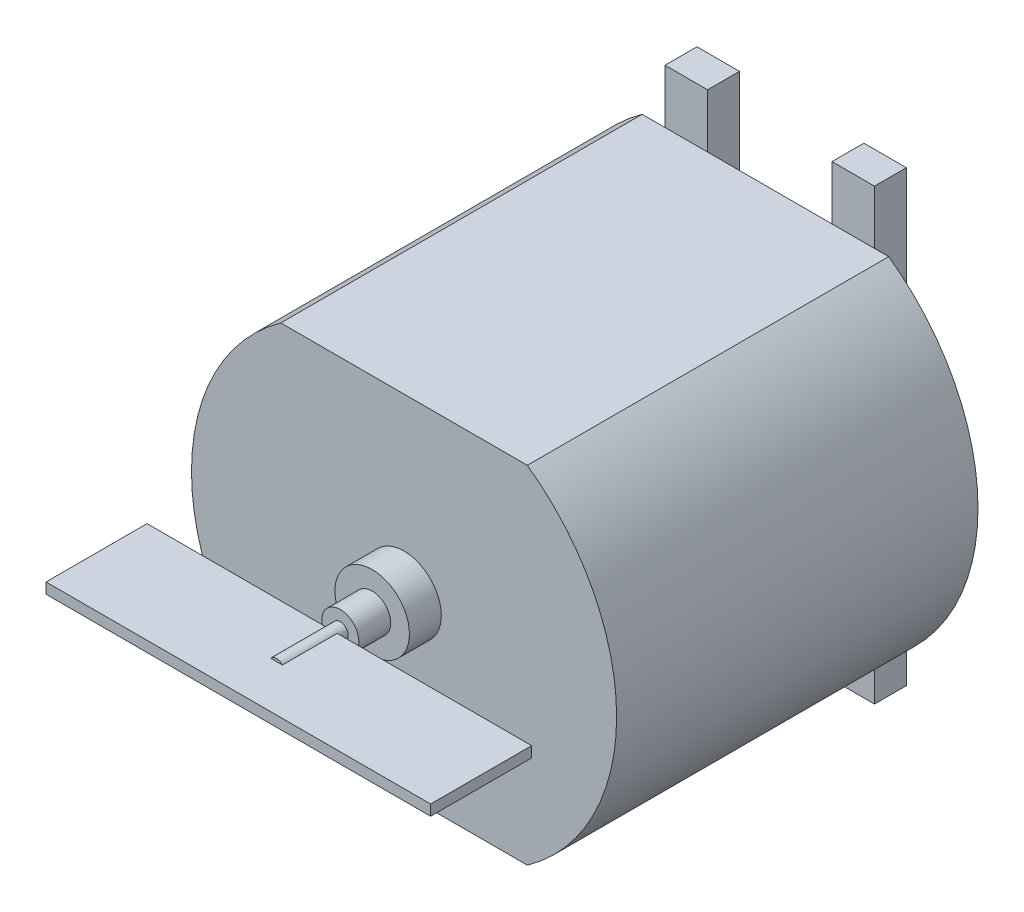
ISO-10303-21;
HEADER;
FILE_DESCRIPTION(('STEP AP214'),'2;1');
FILE_NAME('part.step','',(''),(''),'','','');
FILE_SCHEMA(('AUTOMOTIVE_DESIGN { 1 0 10303 214 1 1 1 1 }'));
ENDSEC;
DATA;
#1=APPLICATION_CONTEXT('core data for automotive mechanical design processes');
#2=APPLICATION_PROTOCOL_DEFINITION('international standard','automotive_design',2000,#1);
#3=PRODUCT_CONTEXT('',#1,'mechanical');
#4=PRODUCT('Part','Part','',(#3));
#5=PRODUCT_RELATED_PRODUCT_CATEGORY('part','',(#4));
#6=PRODUCT_DEFINITION_FORMATION('','',#4);
#7=PRODUCT_DEFINITION_CONTEXT('part definition',#1,'design');
#8=PRODUCT_DEFINITION('design','',#6,#7);
#9=PRODUCT_DEFINITION_SHAPE('','',#8);
#10=(LENGTH_UNIT() NAMED_UNIT(*) SI_UNIT(.MILLI.,.METRE.));
#11=(NAMED_UNIT(*) PLANE_ANGLE_UNIT() SI_UNIT($,.RADIAN.));
#12=(NAMED_UNIT(*) SI_UNIT($,.STERADIAN.) SOLID_ANGLE_UNIT());
#13=UNCERTAINTY_MEASURE_WITH_UNIT(LENGTH_MEASURE(1.E-05),#10,'distance_accuracy_value','');
#14=(GEOMETRIC_REPRESENTATION_CONTEXT(3) GLOBAL_UNCERTAINTY_ASSIGNED_CONTEXT((#13)) GLOBAL_UNIT_ASSIGNED_CONTEXT((#10,
#11,#12)) REPRESENTATION_CONTEXT('',''));
#15=CARTESIAN_POINT('',(0.,0.,0.));
#16=DIRECTION('',(0.,0.,1.));
#17=DIRECTION('',(1.,0.,0.));
#18=AXIS2_PLACEMENT_3D('',#15,#16,#17);
#19=CARTESIAN_POINT('',(0.,0.,46.));
#20=DIRECTION('',(0.,0.,1.));
#21=DIRECTION('',(1.,0.,0.));
#22=AXIS2_PLACEMENT_3D('',#19,#20,#21);
#23=PLANE('',#22);
#24=CARTESIAN_POINT('',(0.,0.,46.));
#25=DIRECTION('',(0.,0.,1.));
#26=DIRECTION('',(1.,0.,0.));
#27=AXIS2_PLACEMENT_3D('',#24,#25,#26);
#28=CIRCLE('',#27,0.749347306105546);
#29=CARTESIAN_POINT('',(0.558141008319259,0.5,46.));
#30=VERTEX_POINT('',#29);
#31=CARTESIAN_POINT('',(-0.558141008319259,0.5,46.));
#32=VERTEX_POINT('',#31);
#33=EDGE_CURVE('E319',#30,#32,#28,.T.);
#34=ORIENTED_EDGE('',*,*,#33,.T.);
#35=DIRECTION('',(1.,0.,0.));
#36=VECTOR('',#35,1.);
#37=CARTESIAN_POINT('',(0.,0.5,46.));
#38=LINE('',#37,#36);
#39=EDGE_CURVE('E374',#32,#30,#38,.T.);
#40=ORIENTED_EDGE('',*,*,#39,.T.);
#41=EDGE_LOOP('',(#34,#40));
#42=FACE_BOUND('',#41,.T.);
#43=ADVANCED_FACE('F32',(#42),#23,.T.);
#44=CARTESIAN_POINT('',(0.,0.,0.));
#45=DIRECTION('',(0.,0.,1.));
#46=DIRECTION('',(1.,0.,0.));
#47=AXIS2_PLACEMENT_3D('',#44,#45,#46);
#48=PLANE('',#47);
#49=DIRECTION('',(0.,-1.,0.));
#50=VECTOR('',#49,1.);
#51=CARTESIAN_POINT('',(-5.44286471798937,21.369936064893,0.));
#52=LINE('',#51,#50);
#53=CARTESIAN_POINT('',(-5.44286471798937,16.2926966628899,0.));
#54=VERTEX_POINT('',#53);
#55=CARTESIAN_POINT('',(-5.44286471798937,-16.2926966628899,0.));
#56=VERTEX_POINT('',#55);
#57=EDGE_CURVE('E264',#54,#56,#52,.T.);
#58=ORIENTED_EDGE('',*,*,#57,.F.);
#59=DIRECTION('',(-1.,0.,0.));
#60=VECTOR('',#59,1.);
#61=CARTESIAN_POINT('',(-11.5994842752191,16.2926966628899,0.));
#62=LINE('',#61,#60);
#63=CARTESIAN_POINT('',(6.26113840276687,16.2926966628899,0.));
#64=VERTEX_POINT('',#63);
#65=EDGE_CURVE('E497',#64,#54,#62,.T.);
#66=ORIENTED_EDGE('',*,*,#65,.F.);
#67=DIRECTION('',(0.,1.,0.));
#68=VECTOR('',#67,1.);
#69=CARTESIAN_POINT('',(6.26113840276687,21.369936064893,0.));
#70=LINE('',#69,#68);
#71=CARTESIAN_POINT('',(6.26113840276687,-16.2926966628899,0.));
#72=VERTEX_POINT('',#71);
#73=EDGE_CURVE('E305',#72,#64,#70,.T.);
#74=ORIENTED_EDGE('',*,*,#73,.F.);
#75=DIRECTION('',(1.,0.,0.));
#76=VECTOR('',#75,1.);
#77=CARTESIAN_POINT('',(-11.5994842752191,-16.2926966628899,0.));
#78=LINE('',#77,#76);
#79=EDGE_CURVE('E356',#56,#72,#78,.T.);
#80=ORIENTED_EDGE('',*,*,#79,.F.);
#81=EDGE_LOOP('',(#58,#66,#74,#80));
#82=FACE_BOUND('',#81,.T.);
#83=ADVANCED_FACE('F405',(#82),#48,.F.);
#84=DIRECTION('',(0.,1.,0.));
#85=VECTOR('',#84,1.);
#86=CARTESIAN_POINT('',(-9.44286471798937,21.369936064893,0.));
#87=LINE('',#86,#85);
#88=CARTESIAN_POINT('',(-9.44286471798937,-16.2926966628899,0.));
#89=VERTEX_POINT('',#88);
#90=CARTESIAN_POINT('',(-9.44286471798937,16.2926966628899,0.));
#91=VERTEX_POINT('',#90);
#92=EDGE_CURVE('E55',#89,#91,#87,.T.);
#93=ORIENTED_EDGE('',*,*,#92,.F.);
#94=CARTESIAN_POINT('',(-11.5994842752191,-16.2926966628899,0.));
#95=VERTEX_POINT('',#94);
#96=EDGE_CURVE('E352',#95,#89,#78,.T.);
#97=ORIENTED_EDGE('',*,*,#96,.F.);
#98=CARTESIAN_POINT('',(0.,0.,0.));
#99=DIRECTION('',(0.,0.,1.));
#100=DIRECTION('',(1.,0.,0.));
#101=AXIS2_PLACEMENT_3D('',#98,#99,#100);
#102=CIRCLE('',#101,20.);
#103=CARTESIAN_POINT('',(-11.5994842752191,16.2926966628899,0.));
#104=VERTEX_POINT('',#103);
#105=EDGE_CURVE('E335',#104,#95,#102,.T.);
#106=ORIENTED_EDGE('',*,*,#105,.F.);
#107=EDGE_CURVE('E359',#91,#104,#62,.T.);
#108=ORIENTED_EDGE('',*,*,#107,.F.);
#109=EDGE_LOOP('',(#93,#97,#106,#108));
#110=FACE_BOUND('',#109,.T.);
#111=ADVANCED_FACE('F412',(#110),#48,.F.);
#112=DIRECTION('',(0.,-1.,0.));
#113=VECTOR('',#112,1.);
#114=CARTESIAN_POINT('',(10.2611384027669,21.369936064893,0.));
#115=LINE('',#114,#113);
#116=CARTESIAN_POINT('',(10.2611384027669,16.2926966628899,0.));
#117=VERTEX_POINT('',#116);
#118=CARTESIAN_POINT('',(10.2611384027669,-16.2926966628899,0.));
#119=VERTEX_POINT('',#118);
#120=EDGE_CURVE('E299',#117,#119,#115,.T.);
#121=ORIENTED_EDGE('',*,*,#120,.F.);
#122=CARTESIAN_POINT('',(11.5994842752191,16.2926966628899,0.));
#123=VERTEX_POINT('',#122);
#124=EDGE_CURVE('E342',#123,#117,#62,.T.);
#125=ORIENTED_EDGE('',*,*,#124,.F.);
#126=CARTESIAN_POINT('',(0.,0.,0.));
#127=DIRECTION('',(0.,0.,1.));
#128=DIRECTION('',(1.,0.,0.));
#129=AXIS2_PLACEMENT_3D('',#126,#127,#128);
#130=CIRCLE('',#129,20.);
#131=CARTESIAN_POINT('',(11.5994842752191,-16.29269666289,0.));
#132=VERTEX_POINT('',#131);
#133=EDGE_CURVE('E355',#132,#123,#130,.T.);
#134=ORIENTED_EDGE('',*,*,#133,.F.);
#135=EDGE_CURVE('E351',#119,#132,#78,.T.);
#136=ORIENTED_EDGE('',*,*,#135,.F.);
#137=EDGE_LOOP('',(#121,#125,#134,#136));
#138=FACE_BOUND('',#137,.T.);
#139=ADVANCED_FACE('F415',(#138),#48,.F.);
#140=CARTESIAN_POINT('',(0.,0.,34.));
#141=DIRECTION('',(0.,0.,-1.));
#142=DIRECTION('',(-1.,0.,0.));
#143=AXIS2_PLACEMENT_3D('',#140,#141,#142);
#144=CYLINDRICAL_SURFACE('',#143,20.);
#145=ORIENTED_EDGE('',*,*,#105,.T.);
#146=DIRECTION('',(0.,0.,-1.));
#147=VECTOR('',#146,1.);
#148=CARTESIAN_POINT('',(-11.5994842752191,-16.2926966628899,34.));
#149=LINE('',#148,#147);
#150=CARTESIAN_POINT('',(-11.5994842752191,-16.2926966628899,34.));
#151=VERTEX_POINT('',#150);
#152=EDGE_CURVE('E371',#151,#95,#149,.T.);
#153=ORIENTED_EDGE('',*,*,#152,.F.);
#154=CARTESIAN_POINT('',(0.,0.,34.));
#155=DIRECTION('',(0.,0.,1.));
#156=DIRECTION('',(1.,0.,0.));
#157=AXIS2_PLACEMENT_3D('',#154,#155,#156);
#158=CIRCLE('',#157,20.);
#159=CARTESIAN_POINT('',(-11.5994842752191,16.2926966628899,34.));
#160=VERTEX_POINT('',#159);
#161=EDGE_CURVE('E338',#160,#151,#158,.T.);
#162=ORIENTED_EDGE('',*,*,#161,.F.);
#163=DIRECTION('',(0.,0.,-1.));
#164=VECTOR('',#163,1.);
#165=CARTESIAN_POINT('',(-11.5994842752191,16.2926966628899,34.));
#166=LINE('',#165,#164);
#167=EDGE_CURVE('E348',#160,#104,#166,.T.);
#168=ORIENTED_EDGE('',*,*,#167,.T.);
#169=EDGE_LOOP('',(#145,#153,#162,#168));
#170=FACE_BOUND('',#169,.T.);
#171=ADVANCED_FACE('F34',(#170),#144,.T.);
#172=CARTESIAN_POINT('',(-11.5994842752191,-16.2926966628899,34.));
#173=DIRECTION('',(0.,1.,0.));
#174=DIRECTION('',(0.,0.,1.));
#175=AXIS2_PLACEMENT_3D('',#172,#173,#174);
#176=PLANE('',#175);
#177=ORIENTED_EDGE('',*,*,#96,.T.);
#178=DIRECTION('',(-1.,0.,0.));
#179=VECTOR('',#178,1.);
#180=CARTESIAN_POINT('',(-11.5994842752191,-16.2926966628899,0.));
#181=LINE('',#180,#179);
#182=EDGE_CURVE('E281',#56,#89,#181,.T.);
#183=ORIENTED_EDGE('',*,*,#182,.F.);
#184=ORIENTED_EDGE('',*,*,#79,.T.);
#185=EDGE_CURVE('E357',#72,#119,#78,.T.);
#186=ORIENTED_EDGE('',*,*,#185,.T.);
#187=ORIENTED_EDGE('',*,*,#135,.T.);
#188=DIRECTION('',(0.,0.,-1.));
#189=VECTOR('',#188,1.);
#190=CARTESIAN_POINT('',(11.5994842752191,-16.29269666289,34.));
#191=LINE('',#190,#189);
#192=CARTESIAN_POINT('',(11.5994842752191,-16.29269666289,34.));
#193=VERTEX_POINT('',#192);
#194=EDGE_CURVE('E368',#193,#132,#191,.T.);
#195=ORIENTED_EDGE('',*,*,#194,.F.);
#196=DIRECTION('',(1.,0.,0.));
#197=VECTOR('',#196,1.);
#198=CARTESIAN_POINT('',(-11.5994842752191,-16.2926966628899,34.));
#199=LINE('',#198,#197);
#200=EDGE_CURVE('E341',#151,#193,#199,.T.);
#201=ORIENTED_EDGE('',*,*,#200,.F.);
#202=ORIENTED_EDGE('',*,*,#152,.T.);
#203=EDGE_LOOP('',(#177,#183,#184,#186,#187,#195,#201,#202));
#204=FACE_BOUND('',#203,.T.);
#205=ADVANCED_FACE('F511',(#204),#176,.F.);
#206=CARTESIAN_POINT('',(0.,0.,34.));
#207=DIRECTION('',(0.,0.,-1.));
#208=DIRECTION('',(-1.,0.,0.));
#209=AXIS2_PLACEMENT_3D('',#206,#207,#208);
#210=CYLINDRICAL_SURFACE('',#209,20.);
#211=ORIENTED_EDGE('',*,*,#133,.T.);
#212=DIRECTION('',(0.,0.,-1.));
#213=VECTOR('',#212,1.);
#214=CARTESIAN_POINT('',(11.5994842752191,16.2926966628899,34.));
#215=LINE('',#214,#213);
#216=CARTESIAN_POINT('',(11.5994842752191,16.2926966628899,34.));
#217=VERTEX_POINT('',#216);
#218=EDGE_CURVE('E365',#217,#123,#215,.T.);
#219=ORIENTED_EDGE('',*,*,#218,.F.);
#220=CARTESIAN_POINT('',(0.,0.,34.));
#221=DIRECTION('',(0.,0.,1.));
#222=DIRECTION('',(1.,0.,0.));
#223=AXIS2_PLACEMENT_3D('',#220,#221,#222);
#224=CIRCLE('',#223,20.);
#225=EDGE_CURVE('E344',#193,#217,#224,.T.);
#226=ORIENTED_EDGE('',*,*,#225,.F.);
#227=ORIENTED_EDGE('',*,*,#194,.T.);
#228=EDGE_LOOP('',(#211,#219,#226,#227));
#229=FACE_BOUND('',#228,.T.);
#230=ADVANCED_FACE('F534',(#229),#210,.T.);
#231=CARTESIAN_POINT('',(-11.5994842752191,16.2926966628899,34.));
#232=DIRECTION('',(0.,-1.,0.));
#233=DIRECTION('',(0.,0.,-1.));
#234=AXIS2_PLACEMENT_3D('',#231,#232,#233);
#235=PLANE('',#234);
#236=ORIENTED_EDGE('',*,*,#124,.T.);
#237=EDGE_CURVE('E362',#117,#64,#62,.T.);
#238=ORIENTED_EDGE('',*,*,#237,.T.);
#239=ORIENTED_EDGE('',*,*,#65,.T.);
#240=EDGE_CURVE('E498',#54,#91,#62,.T.);
#241=ORIENTED_EDGE('',*,*,#240,.T.);
#242=ORIENTED_EDGE('',*,*,#107,.T.);
#243=ORIENTED_EDGE('',*,*,#167,.F.);
#244=DIRECTION('',(-1.,0.,0.));
#245=VECTOR('',#244,1.);
#246=CARTESIAN_POINT('',(-11.5994842752191,16.2926966628899,34.));
#247=LINE('',#246,#245);
#248=EDGE_CURVE('E346',#217,#160,#247,.T.);
#249=ORIENTED_EDGE('',*,*,#248,.F.);
#250=ORIENTED_EDGE('',*,*,#218,.T.);
#251=EDGE_LOOP('',(#236,#238,#239,#241,#242,#243,#249,#250));
#252=FACE_BOUND('',#251,.T.);
#253=ADVANCED_FACE('F502',(#252),#235,.F.);
#254=CARTESIAN_POINT('',(0.,0.,34.));
#255=DIRECTION('',(0.,0.,1.));
#256=DIRECTION('',(1.,0.,0.));
#257=AXIS2_PLACEMENT_3D('',#254,#255,#256);
#258=PLANE('',#257);
#259=CARTESIAN_POINT('',(0.,0.,34.));
#260=DIRECTION('',(0.,0.,1.));
#261=DIRECTION('',(1.,0.,0.));
#262=AXIS2_PLACEMENT_3D('',#259,#260,#261);
#263=CIRCLE('',#262,3.50367255302534);
#264=CARTESIAN_POINT('',(3.50367255302534,0.,34.));
#265=VERTEX_POINT('',#264);
#266=EDGE_CURVE('E329',#265,#265,#263,.T.);
#267=ORIENTED_EDGE('',*,*,#266,.F.);
#268=EDGE_LOOP('',(#267));
#269=FACE_BOUND('',#268,.T.);
#270=ORIENTED_EDGE('',*,*,#161,.T.);
#271=ORIENTED_EDGE('',*,*,#200,.T.);
#272=ORIENTED_EDGE('',*,*,#225,.T.);
#273=ORIENTED_EDGE('',*,*,#248,.T.);
#274=EDGE_LOOP('',(#270,#271,#272,#273));
#275=FACE_BOUND('',#274,.T.);
#276=ADVANCED_FACE('F515',(#269,#275),#258,.T.);
#277=CARTESIAN_POINT('',(0.,0.,37.));
#278=DIRECTION('',(0.,0.,-1.));
#279=DIRECTION('',(-1.,0.,0.));
#280=AXIS2_PLACEMENT_3D('',#277,#278,#279);
#281=CYLINDRICAL_SURFACE('',#280,3.50367255302534);
#282=CARTESIAN_POINT('',(0.,0.,37.));
#283=DIRECTION('',(0.,0.,1.));
#284=DIRECTION('',(1.,0.,0.));
#285=AXIS2_PLACEMENT_3D('',#282,#283,#284);
#286=CIRCLE('',#285,3.50367255302534);
#287=CARTESIAN_POINT('',(3.50367255302534,0.,37.));
#288=VERTEX_POINT('',#287);
#289=EDGE_CURVE('E332',#288,#288,#286,.T.);
#290=ORIENTED_EDGE('',*,*,#289,.F.);
#291=EDGE_LOOP('',(#290));
#292=FACE_BOUND('',#291,.T.);
#293=ORIENTED_EDGE('',*,*,#266,.T.);
#294=EDGE_LOOP('',(#293));
#295=FACE_BOUND('',#294,.T.);
#296=ADVANCED_FACE('F546',(#292,#295),#281,.T.);
#297=CARTESIAN_POINT('',(0.,0.,37.));
#298=DIRECTION('',(0.,0.,1.));
#299=DIRECTION('',(1.,0.,0.));
#300=AXIS2_PLACEMENT_3D('',#297,#298,#299);
#301=PLANE('',#300);
#302=CARTESIAN_POINT('',(0.,0.,37.));
#303=DIRECTION('',(0.,0.,1.));
#304=DIRECTION('',(1.,0.,0.));
#305=AXIS2_PLACEMENT_3D('',#302,#303,#304);
#306=CIRCLE('',#305,1.74627977740914);
#307=CARTESIAN_POINT('',(1.74627977740914,0.,37.));
#308=VERTEX_POINT('',#307);
#309=EDGE_CURVE('E322',#308,#308,#306,.T.);
#310=ORIENTED_EDGE('',*,*,#309,.F.);
#311=EDGE_LOOP('',(#310));
#312=FACE_BOUND('',#311,.T.);
#313=ORIENTED_EDGE('',*,*,#289,.T.);
#314=EDGE_LOOP('',(#313));
#315=FACE_BOUND('',#314,.T.);
#316=ADVANCED_FACE('F550',(#312,#315),#301,.T.);
#317=CARTESIAN_POINT('',(0.,0.,40.));
#318=DIRECTION('',(0.,0.,-1.));
#319=DIRECTION('',(-1.,0.,0.));
#320=AXIS2_PLACEMENT_3D('',#317,#318,#319);
#321=CYLINDRICAL_SURFACE('',#320,1.74627977740914);
#322=CARTESIAN_POINT('',(0.,0.,40.));
#323=DIRECTION('',(0.,0.,1.));
#324=DIRECTION('',(1.,0.,0.));
#325=AXIS2_PLACEMENT_3D('',#322,#323,#324);
#326=CIRCLE('',#325,1.74627977740914);
#327=CARTESIAN_POINT('',(1.74627977740914,0.,40.));
#328=VERTEX_POINT('',#327);
#329=EDGE_CURVE('E326',#328,#328,#326,.T.);
#330=ORIENTED_EDGE('',*,*,#329,.F.);
#331=EDGE_LOOP('',(#330));
#332=FACE_BOUND('',#331,.T.);
#333=ORIENTED_EDGE('',*,*,#309,.T.);
#334=EDGE_LOOP('',(#333));
#335=FACE_BOUND('',#334,.T.);
#336=ADVANCED_FACE('F554',(#332,#335),#321,.T.);
#337=CARTESIAN_POINT('',(0.,0.,40.));
#338=DIRECTION('',(0.,0.,1.));
#339=DIRECTION('',(1.,0.,0.));
#340=AXIS2_PLACEMENT_3D('',#337,#338,#339);
#341=PLANE('',#340);
#342=CARTESIAN_POINT('',(0.,0.,40.));
#343=DIRECTION('',(0.,0.,1.));
#344=DIRECTION('',(1.,0.,0.));
#345=AXIS2_PLACEMENT_3D('',#342,#343,#344);
#346=CIRCLE('',#345,0.749347306105546);
#347=CARTESIAN_POINT('',(0.749347306105546,0.,40.));
#348=VERTEX_POINT('',#347);
#349=EDGE_CURVE('E318',#348,#348,#346,.T.);
#350=ORIENTED_EDGE('',*,*,#349,.F.);
#351=EDGE_LOOP('',(#350));
#352=FACE_BOUND('',#351,.T.);
#353=ORIENTED_EDGE('',*,*,#329,.T.);
#354=EDGE_LOOP('',(#353));
#355=FACE_BOUND('',#354,.T.);
#356=ADVANCED_FACE('F429',(#352,#355),#341,.T.);
#357=CARTESIAN_POINT('',(0.,0.,46.));
#358=DIRECTION('',(0.,0.,-1.));
#359=DIRECTION('',(-1.,0.,0.));
#360=AXIS2_PLACEMENT_3D('',#357,#358,#359);
#361=CYLINDRICAL_SURFACE('',#360,0.749347306105546);
#362=CARTESIAN_POINT('',(-0.558141008319259,-0.5,46.));
#363=VERTEX_POINT('',#362);
#364=CARTESIAN_POINT('',(0.558141008319259,-0.5,46.));
#365=VERTEX_POINT('',#364);
#366=EDGE_CURVE('E323',#363,#365,#28,.T.);
#367=ORIENTED_EDGE('',*,*,#366,.F.);
#368=DIRECTION('',(0.,0.,-1.));
#369=VECTOR('',#368,1.);
#370=CARTESIAN_POINT('',(-0.558141008319259,-0.5,46.));
#371=LINE('',#370,#369);
#372=CARTESIAN_POINT('',(-0.55814100831926,-0.5,40.8503491859536));
#373=VERTEX_POINT('',#372);
#374=EDGE_CURVE('E245',#363,#373,#371,.T.);
#375=ORIENTED_EDGE('',*,*,#374,.T.);
#376=CARTESIAN_POINT('',(0.,0.,40.8503491859536));
#377=DIRECTION('',(0.,0.,-1.));
#378=DIRECTION('',(-1.,0.,0.));
#379=AXIS2_PLACEMENT_3D('',#376,#377,#378);
#380=CIRCLE('',#379,0.749347306105546);
#381=CARTESIAN_POINT('',(-0.55814100831926,0.5,40.8503491859536));
#382=VERTEX_POINT('',#381);
#383=EDGE_CURVE('E11',#373,#382,#380,.T.);
#384=ORIENTED_EDGE('',*,*,#383,.T.);
#385=DIRECTION('',(0.,0.,-1.));
#386=VECTOR('',#385,1.);
#387=CARTESIAN_POINT('',(-0.558141008319259,0.5,46.));
#388=LINE('',#387,#386);
#389=EDGE_CURVE('E240',#32,#382,#388,.T.);
#390=ORIENTED_EDGE('',*,*,#389,.F.);
#391=ORIENTED_EDGE('',*,*,#33,.F.);
#392=DIRECTION('',(0.,0.,-1.));
#393=VECTOR('',#392,1.);
#394=CARTESIAN_POINT('',(0.558141008319259,0.5,46.));
#395=LINE('',#394,#393);
#396=CARTESIAN_POINT('',(0.55814100831926,0.5,40.8503491859536));
#397=VERTEX_POINT('',#396);
#398=EDGE_CURVE('E47',#397,#30,#395,.F.);
#399=ORIENTED_EDGE('',*,*,#398,.F.);
#400=CARTESIAN_POINT('',(0.55814100831926,-0.5,40.8503491859536));
#401=VERTEX_POINT('',#400);
#402=EDGE_CURVE('E36',#397,#401,#380,.T.);
#403=ORIENTED_EDGE('',*,*,#402,.T.);
#404=DIRECTION('',(0.,0.,-1.));
#405=VECTOR('',#404,1.);
#406=CARTESIAN_POINT('',(0.558141008319259,-0.5,46.));
#407=LINE('',#406,#405);
#408=EDGE_CURVE('E242',#401,#365,#407,.F.);
#409=ORIENTED_EDGE('',*,*,#408,.T.);
#410=EDGE_LOOP('',(#367,#375,#384,#390,#391,#399,#403,#409));
#411=FACE_BOUND('',#410,.T.);
#412=ORIENTED_EDGE('',*,*,#349,.T.);
#413=EDGE_LOOP('',(#412));
#414=FACE_BOUND('',#413,.T.);
#415=ADVANCED_FACE('F381',(#411,#414),#361,.T.);
#416=DIRECTION('',(1.,0.,0.));
#417=VECTOR('',#416,1.);
#418=CARTESIAN_POINT('',(0.,-0.5,46.));
#419=LINE('',#418,#417);
#420=EDGE_CURVE('E375',#363,#365,#419,.T.);
#421=ORIENTED_EDGE('',*,*,#420,.F.);
#422=ORIENTED_EDGE('',*,*,#366,.T.);
#423=EDGE_LOOP('',(#421,#422));
#424=FACE_BOUND('',#423,.T.);
#425=ADVANCED_FACE('F408',(#424),#23,.T.);
#426=CARTESIAN_POINT('',(0.,0.,0.));
#427=DIRECTION('',(0.,0.,-1.));
#428=DIRECTION('',(-1.,0.,0.));
#429=AXIS2_PLACEMENT_3D('',#426,#427,#428);
#430=PLANE('',#429);
#431=ORIENTED_EDGE('',*,*,#237,.F.);
#432=CARTESIAN_POINT('',(10.2611384027669,21.369936064893,0.));
#433=VERTEX_POINT('',#432);
#434=EDGE_CURVE('E295',#433,#117,#115,.T.);
#435=ORIENTED_EDGE('',*,*,#434,.F.);
#436=DIRECTION('',(1.,0.,0.));
#437=VECTOR('',#436,1.);
#438=CARTESIAN_POINT('',(10.2611384027669,21.369936064893,0.));
#439=LINE('',#438,#437);
#440=CARTESIAN_POINT('',(6.26113840276687,21.369936064893,0.));
#441=VERTEX_POINT('',#440);
#442=EDGE_CURVE('E288',#441,#433,#439,.T.);
#443=ORIENTED_EDGE('',*,*,#442,.F.);
#444=EDGE_CURVE('E301',#64,#441,#70,.T.);
#445=ORIENTED_EDGE('',*,*,#444,.F.);
#446=EDGE_LOOP('',(#431,#435,#443,#445));
#447=FACE_BOUND('',#446,.T.);
#448=ADVANCED_FACE('F419',(#447),#430,.F.);
#449=CARTESIAN_POINT('',(10.2611384027669,21.369936064893,-3.));
#450=DIRECTION('',(-1.,0.,0.));
#451=DIRECTION('',(0.,0.,1.));
#452=AXIS2_PLACEMENT_3D('',#449,#450,#451);
#453=PLANE('',#452);
#454=ORIENTED_EDGE('',*,*,#434,.T.);
#455=ORIENTED_EDGE('',*,*,#120,.T.);
#456=CARTESIAN_POINT('',(10.2611384027669,-20.8345723221394,0.));
#457=VERTEX_POINT('',#456);
#458=EDGE_CURVE('E283',#119,#457,#115,.T.);
#459=ORIENTED_EDGE('',*,*,#458,.T.);
#460=DIRECTION('',(0.,0.,1.));
#461=VECTOR('',#460,1.);
#462=CARTESIAN_POINT('',(10.2611384027669,-20.8345723221394,-3.));
#463=LINE('',#462,#461);
#464=CARTESIAN_POINT('',(10.2611384027669,-20.8345723221394,-3.));
#465=VERTEX_POINT('',#464);
#466=EDGE_CURVE('E315',#465,#457,#463,.T.);
#467=ORIENTED_EDGE('',*,*,#466,.F.);
#468=DIRECTION('',(0.,-1.,0.));
#469=VECTOR('',#468,1.);
#470=CARTESIAN_POINT('',(10.2611384027669,21.369936064893,-3.));
#471=LINE('',#470,#469);
#472=CARTESIAN_POINT('',(10.2611384027669,21.369936064893,-3.));
#473=VERTEX_POINT('',#472);
#474=EDGE_CURVE('E284',#473,#465,#471,.T.);
#475=ORIENTED_EDGE('',*,*,#474,.F.);
#476=DIRECTION('',(0.,0.,1.));
#477=VECTOR('',#476,1.);
#478=CARTESIAN_POINT('',(10.2611384027669,21.369936064893,-3.));
#479=LINE('',#478,#477);
#480=EDGE_CURVE('E294',#473,#433,#479,.T.);
#481=ORIENTED_EDGE('',*,*,#480,.T.);
#482=EDGE_LOOP('',(#454,#455,#459,#467,#475,#481));
#483=FACE_BOUND('',#482,.T.);
#484=ADVANCED_FACE('F425',(#483),#453,.F.);
#485=CARTESIAN_POINT('',(10.2611384027669,-20.8345723221394,-3.));
#486=DIRECTION('',(0.,1.,0.));
#487=DIRECTION('',(0.,0.,1.));
#488=AXIS2_PLACEMENT_3D('',#485,#486,#487);
#489=PLANE('',#488);
#490=DIRECTION('',(-1.,0.,0.));
#491=VECTOR('',#490,1.);
#492=CARTESIAN_POINT('',(10.2611384027669,-20.8345723221394,0.));
#493=LINE('',#492,#491);
#494=CARTESIAN_POINT('',(6.26113840276686,-20.8345723221394,0.));
#495=VERTEX_POINT('',#494);
#496=EDGE_CURVE('E298',#457,#495,#493,.T.);
#497=ORIENTED_EDGE('',*,*,#496,.T.);
#498=DIRECTION('',(0.,0.,1.));
#499=VECTOR('',#498,1.);
#500=CARTESIAN_POINT('',(6.26113840276686,-20.8345723221394,-3.));
#501=LINE('',#500,#499);
#502=CARTESIAN_POINT('',(6.26113840276686,-20.8345723221394,-3.));
#503=VERTEX_POINT('',#502);
#504=EDGE_CURVE('E312',#503,#495,#501,.T.);
#505=ORIENTED_EDGE('',*,*,#504,.F.);
#506=DIRECTION('',(-1.,0.,0.));
#507=VECTOR('',#506,1.);
#508=CARTESIAN_POINT('',(10.2611384027669,-20.8345723221394,-3.));
#509=LINE('',#508,#507);
#510=EDGE_CURVE('E287',#465,#503,#509,.T.);
#511=ORIENTED_EDGE('',*,*,#510,.F.);
#512=ORIENTED_EDGE('',*,*,#466,.T.);
#513=EDGE_LOOP('',(#497,#505,#511,#512));
#514=FACE_BOUND('',#513,.T.);
#515=ADVANCED_FACE('F478',(#514),#489,.F.);
#516=CARTESIAN_POINT('',(6.26113840276687,21.369936064893,-3.));
#517=DIRECTION('',(1.,0.,0.));
#518=DIRECTION('',(0.,1.,0.));
#519=AXIS2_PLACEMENT_3D('',#516,#517,#518);
#520=PLANE('',#519);
#521=EDGE_CURVE('E302',#495,#72,#70,.T.);
#522=ORIENTED_EDGE('',*,*,#521,.T.);
#523=ORIENTED_EDGE('',*,*,#73,.T.);
#524=ORIENTED_EDGE('',*,*,#444,.T.);
#525=DIRECTION('',(0.,0.,1.));
#526=VECTOR('',#525,1.);
#527=CARTESIAN_POINT('',(6.26113840276687,21.369936064893,-3.));
#528=LINE('',#527,#526);
#529=CARTESIAN_POINT('',(6.26113840276687,21.369936064893,-3.));
#530=VERTEX_POINT('',#529);
#531=EDGE_CURVE('E309',#530,#441,#528,.T.);
#532=ORIENTED_EDGE('',*,*,#531,.F.);
#533=DIRECTION('',(0.,1.,0.));
#534=VECTOR('',#533,1.);
#535=CARTESIAN_POINT('',(6.26113840276687,21.369936064893,-3.));
#536=LINE('',#535,#534);
#537=EDGE_CURVE('E290',#503,#530,#536,.T.);
#538=ORIENTED_EDGE('',*,*,#537,.F.);
#539=ORIENTED_EDGE('',*,*,#504,.T.);
#540=EDGE_LOOP('',(#522,#523,#524,#532,#538,#539));
#541=FACE_BOUND('',#540,.T.);
#542=ADVANCED_FACE('F474',(#541),#520,.F.);
#543=CARTESIAN_POINT('',(10.2611384027669,21.369936064893,-3.));
#544=DIRECTION('',(0.,-1.,0.));
#545=DIRECTION('',(0.,0.,-1.));
#546=AXIS2_PLACEMENT_3D('',#543,#544,#545);
#547=PLANE('',#546);
#548=ORIENTED_EDGE('',*,*,#442,.T.);
#549=ORIENTED_EDGE('',*,*,#480,.F.);
#550=DIRECTION('',(1.,0.,0.));
#551=VECTOR('',#550,1.);
#552=CARTESIAN_POINT('',(10.2611384027669,21.369936064893,-3.));
#553=LINE('',#552,#551);
#554=EDGE_CURVE('E292',#530,#473,#553,.T.);
#555=ORIENTED_EDGE('',*,*,#554,.F.);
#556=ORIENTED_EDGE('',*,*,#531,.T.);
#557=EDGE_LOOP('',(#548,#549,#555,#556));
#558=FACE_BOUND('',#557,.T.);
#559=ADVANCED_FACE('F467',(#558),#547,.F.);
#560=CARTESIAN_POINT('',(0.,0.,-3.));
#561=DIRECTION('',(0.,0.,-1.));
#562=DIRECTION('',(-1.,0.,0.));
#563=AXIS2_PLACEMENT_3D('',#560,#561,#562);
#564=PLANE('',#563);
#565=ORIENTED_EDGE('',*,*,#474,.T.);
#566=ORIENTED_EDGE('',*,*,#510,.T.);
#567=ORIENTED_EDGE('',*,*,#537,.T.);
#568=ORIENTED_EDGE('',*,*,#554,.T.);
#569=EDGE_LOOP('',(#565,#566,#567,#568));
#570=FACE_BOUND('',#569,.T.);
#571=ADVANCED_FACE('F465',(#570),#564,.T.);
#572=ORIENTED_EDGE('',*,*,#185,.F.);
#573=ORIENTED_EDGE('',*,*,#521,.F.);
#574=ORIENTED_EDGE('',*,*,#496,.F.);
#575=ORIENTED_EDGE('',*,*,#458,.F.);
#576=EDGE_LOOP('',(#572,#573,#574,#575));
#577=FACE_BOUND('',#576,.T.);
#578=ADVANCED_FACE('F428',(#577),#430,.F.);
#579=CARTESIAN_POINT('',(0.,0.,0.));
#580=DIRECTION('',(0.,0.,-1.));
#581=DIRECTION('',(-1.,0.,0.));
#582=AXIS2_PLACEMENT_3D('',#579,#580,#581);
#583=PLANE('',#582);
#584=CARTESIAN_POINT('',(-5.44286471798937,-20.8345723221394,0.));
#585=VERTEX_POINT('',#584);
#586=EDGE_CURVE('E248',#56,#585,#52,.T.);
#587=ORIENTED_EDGE('',*,*,#586,.F.);
#588=ORIENTED_EDGE('',*,*,#182,.T.);
#589=CARTESIAN_POINT('',(-9.44286471798937,-20.8345723221394,0.));
#590=VERTEX_POINT('',#589);
#591=EDGE_CURVE('E267',#590,#89,#87,.T.);
#592=ORIENTED_EDGE('',*,*,#591,.F.);
#593=DIRECTION('',(-1.,0.,0.));
#594=VECTOR('',#593,1.);
#595=CARTESIAN_POINT('',(-5.44286471798937,-20.8345723221394,0.));
#596=LINE('',#595,#594);
#597=EDGE_CURVE('E263',#585,#590,#596,.T.);
#598=ORIENTED_EDGE('',*,*,#597,.F.);
#599=EDGE_LOOP('',(#587,#588,#592,#598));
#600=FACE_BOUND('',#599,.T.);
#601=ADVANCED_FACE('F446',(#600),#583,.F.);
#602=CARTESIAN_POINT('',(-9.44286471798937,21.369936064893,0.));
#603=VERTEX_POINT('',#602);
#604=EDGE_CURVE('E266',#91,#603,#87,.T.);
#605=ORIENTED_EDGE('',*,*,#604,.F.);
#606=ORIENTED_EDGE('',*,*,#240,.F.);
#607=CARTESIAN_POINT('',(-5.44286471798937,21.369936064893,0.));
#608=VERTEX_POINT('',#607);
#609=EDGE_CURVE('E260',#608,#54,#52,.T.);
#610=ORIENTED_EDGE('',*,*,#609,.F.);
#611=DIRECTION('',(1.,0.,0.));
#612=VECTOR('',#611,1.);
#613=CARTESIAN_POINT('',(-5.44286471798937,21.369936064893,0.));
#614=LINE('',#613,#612);
#615=EDGE_CURVE('E253',#603,#608,#614,.T.);
#616=ORIENTED_EDGE('',*,*,#615,.F.);
#617=EDGE_LOOP('',(#605,#606,#610,#616));
#618=FACE_BOUND('',#617,.T.);
#619=ADVANCED_FACE('F449',(#618),#583,.F.);
#620=CARTESIAN_POINT('',(-5.44286471798937,21.369936064893,-3.));
#621=DIRECTION('',(-1.,0.,0.));
#622=DIRECTION('',(0.,-1.,0.));
#623=AXIS2_PLACEMENT_3D('',#620,#621,#622);
#624=PLANE('',#623);
#625=ORIENTED_EDGE('',*,*,#609,.T.);
#626=ORIENTED_EDGE('',*,*,#57,.T.);
#627=ORIENTED_EDGE('',*,*,#586,.T.);
#628=DIRECTION('',(0.,0.,1.));
#629=VECTOR('',#628,1.);
#630=CARTESIAN_POINT('',(-5.44286471798937,-20.8345723221394,-3.));
#631=LINE('',#630,#629);
#632=CARTESIAN_POINT('',(-5.44286471798937,-20.8345723221394,-3.));
#633=VERTEX_POINT('',#632);
#634=EDGE_CURVE('E278',#633,#585,#631,.T.);
#635=ORIENTED_EDGE('',*,*,#634,.F.);
#636=DIRECTION('',(0.,-1.,0.));
#637=VECTOR('',#636,1.);
#638=CARTESIAN_POINT('',(-5.44286471798937,21.369936064893,-3.));
#639=LINE('',#638,#637);
#640=CARTESIAN_POINT('',(-5.44286471798937,21.369936064893,-3.));
#641=VERTEX_POINT('',#640);
#642=EDGE_CURVE('E249',#641,#633,#639,.T.);
#643=ORIENTED_EDGE('',*,*,#642,.F.);
#644=DIRECTION('',(0.,0.,1.));
#645=VECTOR('',#644,1.);
#646=CARTESIAN_POINT('',(-5.44286471798937,21.369936064893,-3.));
#647=LINE('',#646,#645);
#648=EDGE_CURVE('E259',#641,#608,#647,.T.);
#649=ORIENTED_EDGE('',*,*,#648,.T.);
#650=EDGE_LOOP('',(#625,#626,#627,#635,#643,#649));
#651=FACE_BOUND('',#650,.T.);
#652=ADVANCED_FACE('F460',(#651),#624,.F.);
#653=CARTESIAN_POINT('',(-5.44286471798937,-20.8345723221394,-3.));
#654=DIRECTION('',(0.,1.,0.));
#655=DIRECTION('',(0.,0.,1.));
#656=AXIS2_PLACEMENT_3D('',#653,#654,#655);
#657=PLANE('',#656);
#658=ORIENTED_EDGE('',*,*,#597,.T.);
#659=DIRECTION('',(0.,0.,1.));
#660=VECTOR('',#659,1.);
#661=CARTESIAN_POINT('',(-9.44286471798937,-20.8345723221394,-3.));
#662=LINE('',#661,#660);
#663=CARTESIAN_POINT('',(-9.44286471798937,-20.8345723221394,-3.));
#664=VERTEX_POINT('',#663);
#665=EDGE_CURVE('E275',#664,#590,#662,.T.);
#666=ORIENTED_EDGE('',*,*,#665,.F.);
#667=DIRECTION('',(-1.,0.,0.));
#668=VECTOR('',#667,1.);
#669=CARTESIAN_POINT('',(-5.44286471798937,-20.8345723221394,-3.));
#670=LINE('',#669,#668);
#671=EDGE_CURVE('E252',#633,#664,#670,.T.);
#672=ORIENTED_EDGE('',*,*,#671,.F.);
#673=ORIENTED_EDGE('',*,*,#634,.T.);
#674=EDGE_LOOP('',(#658,#666,#672,#673));
#675=FACE_BOUND('',#674,.T.);
#676=ADVANCED_FACE('F457',(#675),#657,.F.);
#677=CARTESIAN_POINT('',(-9.44286471798937,21.369936064893,-3.));
#678=DIRECTION('',(1.,0.,0.));
#679=DIRECTION('',(0.,1.,0.));
#680=AXIS2_PLACEMENT_3D('',#677,#678,#679);
#681=PLANE('',#680);
#682=ORIENTED_EDGE('',*,*,#591,.T.);
#683=ORIENTED_EDGE('',*,*,#92,.T.);
#684=ORIENTED_EDGE('',*,*,#604,.T.);
#685=DIRECTION('',(0.,0.,1.));
#686=VECTOR('',#685,1.);
#687=CARTESIAN_POINT('',(-9.44286471798937,21.369936064893,-3.));
#688=LINE('',#687,#686);
#689=CARTESIAN_POINT('',(-9.44286471798937,21.369936064893,-3.));
#690=VERTEX_POINT('',#689);
#691=EDGE_CURVE('E272',#690,#603,#688,.T.);
#692=ORIENTED_EDGE('',*,*,#691,.F.);
#693=DIRECTION('',(0.,1.,0.));
#694=VECTOR('',#693,1.);
#695=CARTESIAN_POINT('',(-9.44286471798937,21.369936064893,-3.));
#696=LINE('',#695,#694);
#697=EDGE_CURVE('E255',#664,#690,#696,.T.);
#698=ORIENTED_EDGE('',*,*,#697,.F.);
#699=ORIENTED_EDGE('',*,*,#665,.T.);
#700=EDGE_LOOP('',(#682,#683,#684,#692,#698,#699));
#701=FACE_BOUND('',#700,.T.);
#702=ADVANCED_FACE('F453',(#701),#681,.F.);
#703=CARTESIAN_POINT('',(-5.44286471798937,21.369936064893,-3.));
#704=DIRECTION('',(0.,-1.,0.));
#705=DIRECTION('',(0.,0.,-1.));
#706=AXIS2_PLACEMENT_3D('',#703,#704,#705);
#707=PLANE('',#706);
#708=ORIENTED_EDGE('',*,*,#615,.T.);
#709=ORIENTED_EDGE('',*,*,#648,.F.);
#710=DIRECTION('',(1.,0.,0.));
#711=VECTOR('',#710,1.);
#712=CARTESIAN_POINT('',(-5.44286471798937,21.369936064893,-3.));
#713=LINE('',#712,#711);
#714=EDGE_CURVE('E257',#690,#641,#713,.T.);
#715=ORIENTED_EDGE('',*,*,#714,.F.);
#716=ORIENTED_EDGE('',*,*,#691,.T.);
#717=EDGE_LOOP('',(#708,#709,#715,#716));
#718=FACE_BOUND('',#717,.T.);
#719=ADVANCED_FACE('F444',(#718),#707,.F.);
#720=CARTESIAN_POINT('',(0.,0.,-3.));
#721=DIRECTION('',(0.,0.,-1.));
#722=DIRECTION('',(-1.,0.,0.));
#723=AXIS2_PLACEMENT_3D('',#720,#721,#722);
#724=PLANE('',#723);
#725=ORIENTED_EDGE('',*,*,#642,.T.);
#726=ORIENTED_EDGE('',*,*,#671,.T.);
#727=ORIENTED_EDGE('',*,*,#697,.T.);
#728=ORIENTED_EDGE('',*,*,#714,.T.);
#729=EDGE_LOOP('',(#725,#726,#727,#728));
#730=FACE_BOUND('',#729,.T.);
#731=ADVANCED_FACE('F401',(#730),#724,.T.);
#732=CARTESIAN_POINT('',(-17.3315135425373,-0.5,40.8503491859536));
#733=DIRECTION('',(0.,0.,-1.));
#734=DIRECTION('',(-1.,0.,0.));
#735=AXIS2_PLACEMENT_3D('',#732,#733,#734);
#736=PLANE('',#735);
#737=ORIENTED_EDGE('',*,*,#402,.F.);
#738=DIRECTION('',(-1.,0.,0.));
#739=VECTOR('',#738,1.);
#740=CARTESIAN_POINT('',(-17.3315135425373,0.5,40.8503491859536));
#741=LINE('',#740,#739);
#742=CARTESIAN_POINT('',(18.8551630847378,0.5,40.8503491859536));
#743=VERTEX_POINT('',#742);
#744=EDGE_CURVE('E223',#743,#397,#741,.T.);
#745=ORIENTED_EDGE('',*,*,#744,.F.);
#746=DIRECTION('',(0.,1.,0.));
#747=VECTOR('',#746,1.);
#748=CARTESIAN_POINT('',(18.8551630847378,-0.5,40.8503491859536));
#749=LINE('',#748,#747);
#750=CARTESIAN_POINT('',(18.8551630847378,-0.5,40.8503491859536));
#751=VERTEX_POINT('',#750);
#752=EDGE_CURVE('E236',#751,#743,#749,.T.);
#753=ORIENTED_EDGE('',*,*,#752,.F.);
#754=DIRECTION('',(-1.,0.,0.));
#755=VECTOR('',#754,1.);
#756=CARTESIAN_POINT('',(-17.3315135425373,-0.5,40.8503491859536));
#757=LINE('',#756,#755);
#758=EDGE_CURVE('E207',#751,#401,#757,.T.);
#759=ORIENTED_EDGE('',*,*,#758,.T.);
#760=EDGE_LOOP('',(#737,#745,#753,#759));
#761=FACE_BOUND('',#760,.T.);
#762=ADVANCED_FACE('F387',(#761),#736,.T.);
#763=CARTESIAN_POINT('',(0.,-0.5,0.));
#764=DIRECTION('',(0.,-1.,0.));
#765=DIRECTION('',(0.,0.,-1.));
#766=AXIS2_PLACEMENT_3D('',#763,#764,#765);
#767=PLANE('',#766);
#768=ORIENTED_EDGE('',*,*,#374,.F.);
#769=ORIENTED_EDGE('',*,*,#420,.T.);
#770=ORIENTED_EDGE('',*,*,#408,.F.);
#771=ORIENTED_EDGE('',*,*,#758,.F.);
#772=DIRECTION('',(0.,0.,-1.));
#773=VECTOR('',#772,1.);
#774=CARTESIAN_POINT('',(18.8551630847378,-0.5,50.3568517045778));
#775=LINE('',#774,#773);
#776=CARTESIAN_POINT('',(18.8551630847378,-0.5,50.3568517045778));
#777=VERTEX_POINT('',#776);
#778=EDGE_CURVE('E228',#777,#751,#775,.T.);
#779=ORIENTED_EDGE('',*,*,#778,.F.);
#780=DIRECTION('',(1.,0.,0.));
#781=VECTOR('',#780,1.);
#782=CARTESIAN_POINT('',(-17.3315135425373,-0.5,50.3568517045778));
#783=LINE('',#782,#781);
#784=CARTESIAN_POINT('',(-17.3315135425373,-0.5,50.3568517045778));
#785=VERTEX_POINT('',#784);
#786=EDGE_CURVE('E226',#785,#777,#783,.T.);
#787=ORIENTED_EDGE('',*,*,#786,.F.);
#788=DIRECTION('',(0.,0.,1.));
#789=VECTOR('',#788,1.);
#790=CARTESIAN_POINT('',(-17.3315135425373,-0.5,50.3568517045778));
#791=LINE('',#790,#789);
#792=CARTESIAN_POINT('',(-17.3315135425373,-0.5,40.8503491859536));
#793=VERTEX_POINT('',#792);
#794=EDGE_CURVE('E202',#793,#785,#791,.T.);
#795=ORIENTED_EDGE('',*,*,#794,.F.);
#796=EDGE_CURVE('E231',#373,#793,#757,.T.);
#797=ORIENTED_EDGE('',*,*,#796,.F.);
#798=EDGE_LOOP('',(#768,#769,#770,#771,#779,#787,#795,#797));
#799=FACE_BOUND('',#798,.T.);
#800=ADVANCED_FACE('F392',(#799),#767,.T.);
#801=CARTESIAN_POINT('',(0.,0.5,0.));
#802=DIRECTION('',(0.,-1.,0.));
#803=DIRECTION('',(0.,0.,-1.));
#804=AXIS2_PLACEMENT_3D('',#801,#802,#803);
#805=PLANE('',#804);
#806=ORIENTED_EDGE('',*,*,#39,.F.);
#807=ORIENTED_EDGE('',*,*,#389,.T.);
#808=CARTESIAN_POINT('',(-17.3315135425373,0.5,40.8503491859536));
#809=VERTEX_POINT('',#808);
#810=EDGE_CURVE('E218',#382,#809,#741,.T.);
#811=ORIENTED_EDGE('',*,*,#810,.T.);
#812=DIRECTION('',(0.,0.,1.));
#813=VECTOR('',#812,1.);
#814=CARTESIAN_POINT('',(-17.3315135425373,0.5,50.3568517045778));
#815=LINE('',#814,#813);
#816=CARTESIAN_POINT('',(-17.3315135425373,0.5,50.3568517045778));
#817=VERTEX_POINT('',#816);
#818=EDGE_CURVE('E200',#809,#817,#815,.T.);
#819=ORIENTED_EDGE('',*,*,#818,.T.);
#820=DIRECTION('',(1.,0.,0.));
#821=VECTOR('',#820,1.);
#822=CARTESIAN_POINT('',(-17.3315135425373,0.5,50.3568517045778));
#823=LINE('',#822,#821);
#824=CARTESIAN_POINT('',(18.8551630847378,0.5,50.3568517045778));
#825=VERTEX_POINT('',#824);
#826=EDGE_CURVE('E210',#817,#825,#823,.T.);
#827=ORIENTED_EDGE('',*,*,#826,.T.);
#828=DIRECTION('',(0.,0.,-1.));
#829=VECTOR('',#828,1.);
#830=CARTESIAN_POINT('',(18.8551630847378,0.5,50.3568517045778));
#831=LINE('',#830,#829);
#832=EDGE_CURVE('E214',#825,#743,#831,.T.);
#833=ORIENTED_EDGE('',*,*,#832,.T.);
#834=ORIENTED_EDGE('',*,*,#744,.T.);
#835=ORIENTED_EDGE('',*,*,#398,.T.);
#836=EDGE_LOOP('',(#806,#807,#811,#819,#827,#833,#834,#835));
#837=FACE_BOUND('',#836,.T.);
#838=ADVANCED_FACE('F216',(#837),#805,.F.);
#839=CARTESIAN_POINT('',(-17.3315135425373,-0.5,50.3568517045778));
#840=DIRECTION('',(-1.,0.,0.));
#841=DIRECTION('',(0.,0.,1.));
#842=AXIS2_PLACEMENT_3D('',#839,#840,#841);
#843=PLANE('',#842);
#844=DIRECTION('',(0.,1.,0.));
#845=VECTOR('',#844,1.);
#846=CARTESIAN_POINT('',(-17.3315135425373,-0.5,50.3568517045778));
#847=LINE('',#846,#845);
#848=EDGE_CURVE('E195',#785,#817,#847,.T.);
#849=ORIENTED_EDGE('',*,*,#848,.T.);
#850=ORIENTED_EDGE('',*,*,#818,.F.);
#851=DIRECTION('',(0.,1.,0.));
#852=VECTOR('',#851,1.);
#853=CARTESIAN_POINT('',(-17.3315135425373,-0.5,40.8503491859536));
#854=LINE('',#853,#852);
#855=EDGE_CURVE('E234',#793,#809,#854,.T.);
#856=ORIENTED_EDGE('',*,*,#855,.F.);
#857=ORIENTED_EDGE('',*,*,#794,.T.);
#858=EDGE_LOOP('',(#849,#850,#856,#857));
#859=FACE_BOUND('',#858,.T.);
#860=ADVANCED_FACE('F197',(#859),#843,.T.);
#861=ORIENTED_EDGE('',*,*,#383,.F.);
#862=ORIENTED_EDGE('',*,*,#796,.T.);
#863=ORIENTED_EDGE('',*,*,#855,.T.);
#864=ORIENTED_EDGE('',*,*,#810,.F.);
#865=EDGE_LOOP('',(#861,#862,#863,#864));
#866=FACE_BOUND('',#865,.T.);
#867=ADVANCED_FACE('F403',(#866),#736,.T.);
#868=CARTESIAN_POINT('',(18.8551630847378,-0.5,50.3568517045778));
#869=DIRECTION('',(1.,0.,0.));
#870=DIRECTION('',(0.,0.,-1.));
#871=AXIS2_PLACEMENT_3D('',#868,#869,#870);
#872=PLANE('',#871);
#873=ORIENTED_EDGE('',*,*,#752,.T.);
#874=ORIENTED_EDGE('',*,*,#832,.F.);
#875=DIRECTION('',(0.,1.,0.));
#876=VECTOR('',#875,1.);
#877=CARTESIAN_POINT('',(18.8551630847378,-0.5,50.3568517045778));
#878=LINE('',#877,#876);
#879=EDGE_CURVE('E206',#777,#825,#878,.T.);
#880=ORIENTED_EDGE('',*,*,#879,.F.);
#881=ORIENTED_EDGE('',*,*,#778,.T.);
#882=EDGE_LOOP('',(#873,#874,#880,#881));
#883=FACE_BOUND('',#882,.T.);
#884=ADVANCED_FACE('F390',(#883),#872,.T.);
#885=CARTESIAN_POINT('',(-17.3315135425373,-0.5,50.3568517045778));
#886=DIRECTION('',(0.,0.,1.));
#887=DIRECTION('',(1.,0.,0.));
#888=AXIS2_PLACEMENT_3D('',#885,#886,#887);
#889=PLANE('',#888);
#890=ORIENTED_EDGE('',*,*,#879,.T.);
#891=ORIENTED_EDGE('',*,*,#826,.F.);
#892=ORIENTED_EDGE('',*,*,#848,.F.);
#893=ORIENTED_EDGE('',*,*,#786,.T.);
#894=EDGE_LOOP('',(#890,#891,#892,#893));
#895=FACE_BOUND('',#894,.T.);
#896=ADVANCED_FACE('F211',(#895),#889,.T.);
#897=CLOSED_SHELL('',(#43,#83,#111,#139,#171,#205,#230,#253,#276,#296,#316,#336,#356,#415,#425,
#448,#484,#515,#542,#559,#571,#578,#601,#619,#652,#676,#702,#719,#731,#762,#800,#838,#860,#867,
#884,#896));
#898=MANIFOLD_SOLID_BREP('B2',#897);
#899=ADVANCED_BREP_SHAPE_REPRESENTATION('',(#18,#898),#14);
#900=SHAPE_DEFINITION_REPRESENTATION(#9,#899);
ENDSEC;
END-ISO-10303-21;
